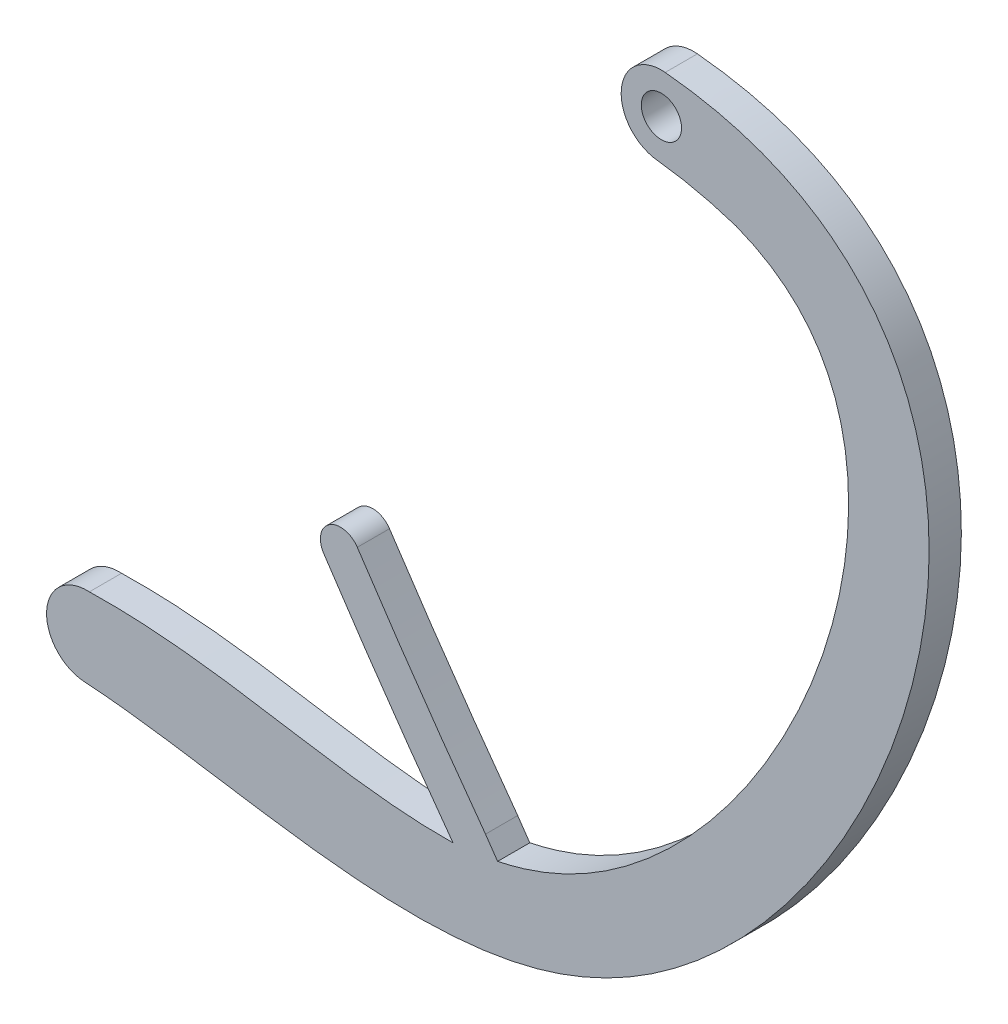
ISO-10303-21;
HEADER;
FILE_DESCRIPTION(('STEP AP214'),'2;1');
FILE_NAME('part.step','',(''),(''),'','','');
FILE_SCHEMA(('AUTOMOTIVE_DESIGN { 1 0 10303 214 1 1 1 1 }'));
ENDSEC;
DATA;
#1=APPLICATION_CONTEXT('core data for automotive mechanical design processes');
#2=APPLICATION_PROTOCOL_DEFINITION('international standard','automotive_design',2000,#1);
#3=PRODUCT_CONTEXT('',#1,'mechanical');
#4=PRODUCT('Part','Part','',(#3));
#5=PRODUCT_RELATED_PRODUCT_CATEGORY('part','',(#4));
#6=PRODUCT_DEFINITION_FORMATION('','',#4);
#7=PRODUCT_DEFINITION_CONTEXT('part definition',#1,'design');
#8=PRODUCT_DEFINITION('design','',#6,#7);
#9=PRODUCT_DEFINITION_SHAPE('','',#8);
#10=(LENGTH_UNIT() NAMED_UNIT(*) SI_UNIT(.MILLI.,.METRE.));
#11=(NAMED_UNIT(*) PLANE_ANGLE_UNIT() SI_UNIT($,.RADIAN.));
#12=(NAMED_UNIT(*) SI_UNIT($,.STERADIAN.) SOLID_ANGLE_UNIT());
#13=UNCERTAINTY_MEASURE_WITH_UNIT(LENGTH_MEASURE(1.E-05),#10,'distance_accuracy_value','');
#14=(GEOMETRIC_REPRESENTATION_CONTEXT(3) GLOBAL_UNCERTAINTY_ASSIGNED_CONTEXT((#13)) GLOBAL_UNIT_ASSIGNED_CONTEXT((#10,
#11,#12)) REPRESENTATION_CONTEXT('',''));
#15=CARTESIAN_POINT('',(0.,0.,0.));
#16=DIRECTION('',(0.,0.,1.));
#17=DIRECTION('',(1.,0.,0.));
#18=AXIS2_PLACEMENT_3D('',#15,#16,#17);
#19=CARTESIAN_POINT('',(16.1856874473945,-14.8286344581212,2.54));
#20=CARTESIAN_POINT('',(13.1592793311377,-13.8183646941323,2.54));
#21=CARTESIAN_POINT('',(9.98762753414302,-13.4478544931215,2.54));
#22=B_SPLINE_CURVE_WITH_KNOTS('',2,(#19,#20,#21),.UNSPECIFIED.,.F.,.F.,(3,3),(0.,1.),.UNSPECIFIED.);
#23=DIRECTION('',(0.,0.,-1.));
#24=VECTOR('',#23,1.);
#25=SURFACE_OF_LINEAR_EXTRUSION('',#22,#24);
#26=CARTESIAN_POINT('',(16.1856874473945,-14.8286344581212,0.));
#27=CARTESIAN_POINT('',(13.1592793311377,-13.8183646941323,0.));
#28=CARTESIAN_POINT('',(9.98762753414302,-13.4478544931215,0.));
#29=B_SPLINE_CURVE_WITH_KNOTS('',2,(#26,#27,#28),.UNSPECIFIED.,.F.,.F.,(3,3),(0.,1.),.UNSPECIFIED.);
#30=CARTESIAN_POINT('',(16.1856874473945,-14.8286344581212,0.));
#31=VERTEX_POINT('',#30);
#32=CARTESIAN_POINT('',(9.98762753414302,-13.4478544931215,0.));
#33=VERTEX_POINT('',#32);
#34=EDGE_CURVE('E152',#31,#33,#29,.T.);
#35=ORIENTED_EDGE('',*,*,#34,.F.);
#36=DIRECTION('',(0.,0.,-1.));
#37=VECTOR('',#36,1.);
#38=CARTESIAN_POINT('',(16.1856874473945,-14.8286344581212,2.54));
#39=LINE('',#38,#37);
#40=CARTESIAN_POINT('',(16.1856874473945,-14.8286344581212,2.54));
#41=VERTEX_POINT('',#40);
#42=EDGE_CURVE('E11',#41,#31,#39,.T.);
#43=ORIENTED_EDGE('',*,*,#42,.F.);
#44=CARTESIAN_POINT('',(9.98762753414302,-13.4478544931215,2.54));
#45=VERTEX_POINT('',#44);
#46=EDGE_CURVE('E255',#41,#45,#22,.T.);
#47=ORIENTED_EDGE('',*,*,#46,.T.);
#48=DIRECTION('',(0.,0.,-1.));
#49=VECTOR('',#48,1.);
#50=CARTESIAN_POINT('',(9.98762753414302,-13.4478544931215,2.54));
#51=LINE('',#50,#49);
#52=EDGE_CURVE('E37',#45,#33,#51,.T.);
#53=ORIENTED_EDGE('',*,*,#52,.T.);
#54=EDGE_LOOP('',(#35,#43,#47,#53));
#55=FACE_BOUND('',#54,.T.);
#56=ADVANCED_FACE('F33',(#55),#25,.T.);
#57=CARTESIAN_POINT('',(16.1856874473945,-14.8286344581212,2.54));
#58=CARTESIAN_POINT('',(16.6265526839877,-14.9997512197157,2.54));
#59=CARTESIAN_POINT('',(17.5162570908955,-15.3893623427278,2.54));
#60=CARTESIAN_POINT('',(19.0485915617488,-16.2336711582584,2.54));
#61=CARTESIAN_POINT('',(20.6658524057302,-17.4471017699291,2.54));
#62=CARTESIAN_POINT('',(22.1922467659509,-19.1302554128112,2.54));
#63=CARTESIAN_POINT('',(23.7873753801757,-21.7207673681195,2.54));
#64=CARTESIAN_POINT('',(25.0194069731203,-25.6971875074979,2.54));
#65=CARTESIAN_POINT('',(25.1871000738286,-31.5671889668932,2.54));
#66=CARTESIAN_POINT('',(23.9978877029221,-38.11128985955,2.54));
#67=CARTESIAN_POINT('',(20.7453501130123,-47.1328580715516,2.54));
#68=CARTESIAN_POINT('',(15.3297519904526,-55.7035893028027,2.54));
#69=CARTESIAN_POINT('',(8.62181953966754,-62.2815309515292,2.54));
#70=CARTESIAN_POINT('',(4.20573237439231,-65.2070479020961,2.54));
#71=CARTESIAN_POINT('',(0.573140932777092,-66.788454542318,2.54));
#72=CARTESIAN_POINT('',(-3.03220827111948,-67.846024472775,2.54));
#73=CARTESIAN_POINT('',(-7.96374607639919,-68.3901296204572,2.54));
#74=CARTESIAN_POINT('',(-14.3347074747987,-68.0859518898144,2.54));
#75=CARTESIAN_POINT('',(-23.2608533730056,-66.851490447541,2.54));
#76=CARTESIAN_POINT('',(-30.2160040508741,-65.6141882043738,2.54));
#77=CARTESIAN_POINT('',(-34.8398667276421,-65.3245668199312,2.54));
#78=B_SPLINE_CURVE_WITH_KNOTS('',3,(#57,#58,#59,#60,#61,#62,#63,#64,#65,#66,#67,#68,#69,#70,#71,
#72,#73,#74,#75,#76,#77),.UNSPECIFIED.,.F.,.F.,(4,1,1,1,1,1,1,1,1,1,1,1,1,1,1,1,1,1,4),
(0.0547334870670623,0.0695032763316395,0.0842730655962166,0.113812644125371,0.143352222654525,
0.17289180118368,0.231970958241988,0.291050115300297,0.350129272358605,0.409208429416914,
0.527366743533531,0.58644590059184,0.645525057650148,0.675064636179303,0.704604214708457,
0.763683371766766,0.822762528825074,0.881841685883383,1.),.UNSPECIFIED.);
#79=DIRECTION('',(0.,0.,-1.));
#80=VECTOR('',#79,1.);
#81=SURFACE_OF_LINEAR_EXTRUSION('',#78,#80);
#82=CARTESIAN_POINT('',(16.1856874473945,-14.8286344581212,0.));
#83=CARTESIAN_POINT('',(16.6265526839877,-14.9997512197157,0.));
#84=CARTESIAN_POINT('',(17.5162570908955,-15.3893623427278,0.));
#85=CARTESIAN_POINT('',(19.0485915617488,-16.2336711582584,0.));
#86=CARTESIAN_POINT('',(20.6658524057302,-17.4471017699291,0.));
#87=CARTESIAN_POINT('',(22.1922467659509,-19.1302554128112,0.));
#88=CARTESIAN_POINT('',(23.7873753801757,-21.7207673681195,0.));
#89=CARTESIAN_POINT('',(25.0194069731203,-25.6971875074979,0.));
#90=CARTESIAN_POINT('',(25.1871000738286,-31.5671889668932,0.));
#91=CARTESIAN_POINT('',(23.9978877029221,-38.11128985955,0.));
#92=CARTESIAN_POINT('',(20.7453501130123,-47.1328580715516,0.));
#93=CARTESIAN_POINT('',(15.3297519904526,-55.7035893028027,0.));
#94=CARTESIAN_POINT('',(8.62181953966754,-62.2815309515292,0.));
#95=CARTESIAN_POINT('',(4.20573237439231,-65.2070479020961,0.));
#96=CARTESIAN_POINT('',(0.573140932777092,-66.788454542318,0.));
#97=CARTESIAN_POINT('',(-3.03220827111948,-67.846024472775,0.));
#98=CARTESIAN_POINT('',(-7.96374607639919,-68.3901296204572,0.));
#99=CARTESIAN_POINT('',(-14.3347074747987,-68.0859518898144,0.));
#100=CARTESIAN_POINT('',(-23.2608533730056,-66.851490447541,0.));
#101=CARTESIAN_POINT('',(-30.2160040508741,-65.6141882043738,0.));
#102=CARTESIAN_POINT('',(-34.8398667276421,-65.3245668199312,0.));
#103=B_SPLINE_CURVE_WITH_KNOTS('',3,(#82,#83,#84,#85,#86,#87,#88,#89,#90,#91,#92,#93,#94,#95,
#96,#97,#98,#99,#100,#101,#102),.UNSPECIFIED.,.F.,.F.,(4,1,1,1,1,1,1,1,1,1,1,1,1,1,1,1,1,1,4),
(0.0547334870670623,0.0695032763316395,0.0842730655962166,0.113812644125371,0.143352222654525,
0.17289180118368,0.231970958241988,0.291050115300297,0.350129272358605,0.409208429416914,
0.527366743533531,0.58644590059184,0.645525057650148,0.675064636179303,0.704604214708457,
0.763683371766766,0.822762528825074,0.881841685883383,1.),.UNSPECIFIED.);
#104=CARTESIAN_POINT('',(-2.63315340917797,-67.6331609804477,0.));
#105=VERTEX_POINT('',#104);
#106=EDGE_CURVE('E259',#31,#105,#103,.T.);
#107=ORIENTED_EDGE('',*,*,#106,.T.);
#108=DIRECTION('',(0.,0.,-1.));
#109=VECTOR('',#108,1.);
#110=CARTESIAN_POINT('',(-2.63315340917797,-67.6331609804477,2.54));
#111=LINE('',#110,#109);
#112=CARTESIAN_POINT('',(-2.63315340917797,-67.6331609804477,2.54));
#113=VERTEX_POINT('',#112);
#114=EDGE_CURVE('E43',#113,#105,#111,.T.);
#115=ORIENTED_EDGE('',*,*,#114,.F.);
#116=EDGE_CURVE('E136',#41,#113,#78,.T.);
#117=ORIENTED_EDGE('',*,*,#116,.F.);
#118=ORIENTED_EDGE('',*,*,#42,.T.);
#119=EDGE_LOOP('',(#107,#115,#117,#118));
#120=FACE_BOUND('',#119,.T.);
#121=ADVANCED_FACE('F160',(#120),#81,.F.);
#122=CARTESIAN_POINT('',(-3.58931879589153,-66.250016050882,2.54));
#123=DIRECTION('',(0.822580681355775,0.568648417442859,0.));
#124=DIRECTION('',(-0.568648417442859,0.822580681355775,0.));
#125=AXIS2_PLACEMENT_3D('',#122,#123,#124);
#126=PLANE('',#125);
#127=CARTESIAN_POINT('',(-3.58931879589153,-66.250016050882,0.));
#128=CARTESIAN_POINT('',(-2.63315340917795,-67.6331609804478,0.));
#129=B_SPLINE_CURVE_WITH_KNOTS('',1,(#127,#128),.UNSPECIFIED.,.F.,.F.,(2,2),(0.,1.),.UNSPECIFIED.);
#130=CARTESIAN_POINT('',(-3.58931879589153,-66.250016050882,0.));
#131=VERTEX_POINT('',#130);
#132=EDGE_CURVE('E123',#131,#105,#129,.T.);
#133=ORIENTED_EDGE('',*,*,#132,.F.);
#134=DIRECTION('',(0.,0.,-1.));
#135=VECTOR('',#134,1.);
#136=CARTESIAN_POINT('',(-3.58931879589153,-66.250016050882,2.54));
#137=LINE('',#136,#135);
#138=CARTESIAN_POINT('',(-3.58931879589153,-66.250016050882,2.54));
#139=VERTEX_POINT('',#138);
#140=EDGE_CURVE('E117',#139,#131,#137,.T.);
#141=ORIENTED_EDGE('',*,*,#140,.F.);
#142=CARTESIAN_POINT('',(-3.58931879589153,-66.250016050882,2.54));
#143=CARTESIAN_POINT('',(-2.63315340917795,-67.6331609804478,2.54));
#144=B_SPLINE_CURVE_WITH_KNOTS('',1,(#142,#143),.UNSPECIFIED.,.F.,.F.,(2,2),(0.,1.),.UNSPECIFIED.);
#145=EDGE_CURVE('E121',#139,#113,#144,.T.);
#146=ORIENTED_EDGE('',*,*,#145,.T.);
#147=ORIENTED_EDGE('',*,*,#114,.T.);
#148=EDGE_LOOP('',(#133,#141,#146,#147));
#149=FACE_BOUND('',#148,.T.);
#150=ADVANCED_FACE('F119',(#149),#126,.T.);
#151=CARTESIAN_POINT('',(-3.58931879589153,-66.250016050882,2.54));
#152=CARTESIAN_POINT('',(-7.08136860731756,-61.4907522581364,2.54));
#153=CARTESIAN_POINT('',(-10.4541546178906,-56.64164042721,2.54));
#154=CARTESIAN_POINT('',(-13.7011656467252,-51.7119423519678,2.54));
#155=B_SPLINE_CURVE_WITH_KNOTS('',3,(#151,#152,#153,#154),.UNSPECIFIED.,.F.,.F.,(4,4),(0.,1.),.UNSPECIFIED.);
#156=DIRECTION('',(0.,0.,-1.));
#157=VECTOR('',#156,1.);
#158=SURFACE_OF_LINEAR_EXTRUSION('',#155,#157);
#159=CARTESIAN_POINT('',(-3.58931879589153,-66.250016050882,0.));
#160=CARTESIAN_POINT('',(-7.08136860731756,-61.4907522581364,0.));
#161=CARTESIAN_POINT('',(-10.4541546178906,-56.64164042721,0.));
#162=CARTESIAN_POINT('',(-13.7011656467252,-51.7119423519678,0.));
#163=B_SPLINE_CURVE_WITH_KNOTS('',3,(#159,#160,#161,#162),.UNSPECIFIED.,.F.,.F.,(4,4),(0.,1.),.UNSPECIFIED.);
#164=CARTESIAN_POINT('',(-13.7011656467252,-51.7119423519678,0.));
#165=VERTEX_POINT('',#164);
#166=EDGE_CURVE('E264',#131,#165,#163,.T.);
#167=ORIENTED_EDGE('',*,*,#166,.T.);
#168=DIRECTION('',(0.,0.,-1.));
#169=VECTOR('',#168,1.);
#170=CARTESIAN_POINT('',(-13.7011656467252,-51.7119423519678,2.54));
#171=LINE('',#170,#169);
#172=CARTESIAN_POINT('',(-13.7011656467252,-51.7119423519678,2.54));
#173=VERTEX_POINT('',#172);
#174=EDGE_CURVE('E126',#173,#165,#171,.T.);
#175=ORIENTED_EDGE('',*,*,#174,.F.);
#176=EDGE_CURVE('E129',#139,#173,#155,.T.);
#177=ORIENTED_EDGE('',*,*,#176,.F.);
#178=ORIENTED_EDGE('',*,*,#140,.T.);
#179=EDGE_LOOP('',(#167,#175,#177,#178));
#180=FACE_BOUND('',#179,.T.);
#181=ADVANCED_FACE('F130',(#180),#158,.F.);
#182=CARTESIAN_POINT('',(-15.0269222457325,-52.5851695218316,2.54));
#183=DIRECTION('',(0.,0.,-1.));
#184=DIRECTION('',(-1.,0.,0.));
#185=AXIS2_PLACEMENT_3D('',#182,#183,#184);
#186=CYLINDRICAL_SURFACE('',#185,1.5875);
#187=CARTESIAN_POINT('',(-15.0269222457325,-52.5851695218316,0.));
#188=DIRECTION('',(0.,0.,1.));
#189=DIRECTION('',(1.,0.,0.));
#190=AXIS2_PLACEMENT_3D('',#187,#188,#189);
#191=CIRCLE('',#190,1.5875);
#192=CARTESIAN_POINT('',(-16.3526788447399,-53.4583966916955,0.));
#193=VERTEX_POINT('',#192);
#194=EDGE_CURVE('E200',#165,#193,#191,.T.);
#195=ORIENTED_EDGE('',*,*,#194,.T.);
#196=DIRECTION('',(0.,0.,-1.));
#197=VECTOR('',#196,1.);
#198=CARTESIAN_POINT('',(-16.3526788447399,-53.4583966916955,2.54));
#199=LINE('',#198,#197);
#200=CARTESIAN_POINT('',(-16.3526788447399,-53.4583966916955,2.54));
#201=VERTEX_POINT('',#200);
#202=EDGE_CURVE('E198',#201,#193,#199,.T.);
#203=ORIENTED_EDGE('',*,*,#202,.F.);
#204=CARTESIAN_POINT('',(-15.0269222457325,-52.5851695218316,2.54));
#205=DIRECTION('',(0.,0.,1.));
#206=DIRECTION('',(1.,0.,0.));
#207=AXIS2_PLACEMENT_3D('',#204,#205,#206);
#208=CIRCLE('',#207,1.5875);
#209=EDGE_CURVE('E133',#173,#201,#208,.T.);
#210=ORIENTED_EDGE('',*,*,#209,.F.);
#211=ORIENTED_EDGE('',*,*,#174,.T.);
#212=EDGE_LOOP('',(#195,#203,#210,#211));
#213=FACE_BOUND('',#212,.T.);
#214=ADVANCED_FACE('F170',(#213),#186,.T.);
#215=CARTESIAN_POINT('',(-6.1491613190421,-68.1282682322118,2.54));
#216=CARTESIAN_POINT('',(-9.67421734563241,-63.3240207498714,2.54));
#217=CARTESIAN_POINT('',(-13.0753898541983,-58.4340635696993,2.54));
#218=CARTESIAN_POINT('',(-16.3526788447399,-53.4583966916955,2.54));
#219=B_SPLINE_CURVE_WITH_KNOTS('',3,(#215,#216,#217,#218),.UNSPECIFIED.,.F.,.F.,(4,4),(0.,1.),.UNSPECIFIED.);
#220=DIRECTION('',(0.,0.,-1.));
#221=VECTOR('',#220,1.);
#222=SURFACE_OF_LINEAR_EXTRUSION('',#219,#221);
#223=CARTESIAN_POINT('',(-6.1491613190421,-68.1282682322118,0.));
#224=CARTESIAN_POINT('',(-9.67421734563241,-63.3240207498714,0.));
#225=CARTESIAN_POINT('',(-13.0753898541983,-58.4340635696993,0.));
#226=CARTESIAN_POINT('',(-16.3526788447399,-53.4583966916955,0.));
#227=B_SPLINE_CURVE_WITH_KNOTS('',3,(#223,#224,#225,#226),.UNSPECIFIED.,.F.,.F.,(4,4),(0.,1.),.UNSPECIFIED.);
#228=CARTESIAN_POINT('',(-6.1491613190421,-68.1282682322118,0.));
#229=VERTEX_POINT('',#228);
#230=EDGE_CURVE('E206',#229,#193,#227,.T.);
#231=ORIENTED_EDGE('',*,*,#230,.F.);
#232=DIRECTION('',(0.,0.,-1.));
#233=VECTOR('',#232,1.);
#234=CARTESIAN_POINT('',(-6.1491613190421,-68.1282682322118,2.54));
#235=LINE('',#234,#233);
#236=CARTESIAN_POINT('',(-6.1491613190421,-68.1282682322118,2.54));
#237=VERTEX_POINT('',#236);
#238=EDGE_CURVE('E203',#237,#229,#235,.T.);
#239=ORIENTED_EDGE('',*,*,#238,.F.);
#240=EDGE_CURVE('E182',#237,#201,#219,.T.);
#241=ORIENTED_EDGE('',*,*,#240,.T.);
#242=ORIENTED_EDGE('',*,*,#202,.T.);
#243=EDGE_LOOP('',(#231,#239,#241,#242));
#244=FACE_BOUND('',#243,.T.);
#245=ADVANCED_FACE('F173',(#244),#222,.T.);
#246=CARTESIAN_POINT('',(-6.1491613190421,-68.1282682322118,2.54));
#247=CARTESIAN_POINT('',(-11.7544050249348,-68.2161560131135,2.54));
#248=CARTESIAN_POINT('',(-21.1788863134655,-66.2414918770751,2.54));
#249=CARTESIAN_POINT('',(-30.778963239153,-65.21520527888,2.54));
#250=CARTESIAN_POINT('',(-34.8398632596566,-65.3245528516356,2.54));
#251=B_SPLINE_CURVE_WITH_KNOTS('',3,(#246,#247,#248,#249,#250),.UNSPECIFIED.,.F.,.F.,(4,1,4),
(0.,0.578093231759391,1.),.UNSPECIFIED.);
#252=DIRECTION('',(0.,0.,-1.));
#253=VECTOR('',#252,1.);
#254=SURFACE_OF_LINEAR_EXTRUSION('',#251,#253);
#255=CARTESIAN_POINT('',(-6.1491613190421,-68.1282682322118,0.));
#256=CARTESIAN_POINT('',(-11.7544050249348,-68.2161560131135,0.));
#257=CARTESIAN_POINT('',(-21.1788863134655,-66.2414918770751,0.));
#258=CARTESIAN_POINT('',(-30.778963239153,-65.21520527888,0.));
#259=CARTESIAN_POINT('',(-34.8398632596566,-65.3245528516356,0.));
#260=B_SPLINE_CURVE_WITH_KNOTS('',3,(#255,#256,#257,#258,#259),.UNSPECIFIED.,.F.,.F.,(4,1,4),
(0.,0.578093231759391,1.),.UNSPECIFIED.);
#261=CARTESIAN_POINT('',(-34.8398632596566,-65.3245528516356,0.));
#262=VERTEX_POINT('',#261);
#263=EDGE_CURVE('E286',#229,#262,#260,.T.);
#264=ORIENTED_EDGE('',*,*,#263,.T.);
#265=DIRECTION('',(0.,0.,-1.));
#266=VECTOR('',#265,1.);
#267=CARTESIAN_POINT('',(-34.8398632596566,-65.3245528516356,2.54));
#268=LINE('',#267,#266);
#269=CARTESIAN_POINT('',(-34.8398632596566,-65.3245528516356,2.54));
#270=VERTEX_POINT('',#269);
#271=EDGE_CURVE('E209',#270,#262,#268,.T.);
#272=ORIENTED_EDGE('',*,*,#271,.F.);
#273=EDGE_CURVE('E187',#237,#270,#251,.T.);
#274=ORIENTED_EDGE('',*,*,#273,.F.);
#275=ORIENTED_EDGE('',*,*,#238,.T.);
#276=EDGE_LOOP('',(#264,#272,#274,#275));
#277=FACE_BOUND('',#276,.T.);
#278=ADVANCED_FACE('F178',(#277),#254,.F.);
#279=CARTESIAN_POINT('',(-35.0383446913326,-68.4933428606579,2.54));
#280=DIRECTION('',(0.,0.,-1.));
#281=DIRECTION('',(-1.,0.,0.));
#282=AXIS2_PLACEMENT_3D('',#279,#280,#281);
#283=CYLINDRICAL_SURFACE('',#282,3.175);
#284=CARTESIAN_POINT('',(-35.0383446913326,-68.4933428606579,0.));
#285=DIRECTION('',(0.,0.,1.));
#286=DIRECTION('',(1.,0.,0.));
#287=AXIS2_PLACEMENT_3D('',#284,#285,#286);
#288=CIRCLE('',#287,3.175);
#289=CARTESIAN_POINT('',(-35.2368261230086,-71.6621328696803,0.));
#290=VERTEX_POINT('',#289);
#291=EDGE_CURVE('E284',#262,#290,#288,.T.);
#292=ORIENTED_EDGE('',*,*,#291,.T.);
#293=DIRECTION('',(0.,0.,-1.));
#294=VECTOR('',#293,1.);
#295=CARTESIAN_POINT('',(-35.2368261230086,-71.6621328696803,2.54));
#296=LINE('',#295,#294);
#297=CARTESIAN_POINT('',(-35.2368261230086,-71.6621328696803,2.54));
#298=VERTEX_POINT('',#297);
#299=EDGE_CURVE('E278',#298,#290,#296,.T.);
#300=ORIENTED_EDGE('',*,*,#299,.F.);
#301=CARTESIAN_POINT('',(-35.0383446913326,-68.4933428606579,2.54));
#302=DIRECTION('',(0.,0.,1.));
#303=DIRECTION('',(1.,0.,0.));
#304=AXIS2_PLACEMENT_3D('',#301,#302,#303);
#305=CIRCLE('',#304,3.175);
#306=EDGE_CURVE('E214',#270,#298,#305,.T.);
#307=ORIENTED_EDGE('',*,*,#306,.F.);
#308=ORIENTED_EDGE('',*,*,#271,.T.);
#309=EDGE_LOOP('',(#292,#300,#307,#308));
#310=FACE_BOUND('',#309,.T.);
#311=ADVANCED_FACE('F230',(#310),#283,.T.);
#312=CARTESIAN_POINT('',(10.586372465857,-7.12614550687844,2.54));
#313=CARTESIAN_POINT('',(11.0025256817417,-7.16556042290348,2.54));
#314=CARTESIAN_POINT('',(11.8420095813493,-7.25959403096603,2.54));
#315=CARTESIAN_POINT('',(13.445793666436,-7.49782194122731,2.54));
#316=CARTESIAN_POINT('',(15.3585084276082,-7.89279020111373,2.54));
#317=CARTESIAN_POINT('',(17.4937154344995,-8.51632734794415,2.54));
#318=CARTESIAN_POINT('',(20.134435016772,-9.54131958514287,2.54));
#319=CARTESIAN_POINT('',(23.0478949522207,-11.1729370862544,2.54));
#320=CARTESIAN_POINT('',(25.9214754737985,-13.6389729032956,2.54));
#321=CARTESIAN_POINT('',(28.1703177338175,-16.5399175807537,2.54));
#322=CARTESIAN_POINT('',(30.3566394985441,-20.8772845417327,2.54));
#323=CARTESIAN_POINT('',(31.6511811302994,-26.9781578874707,2.54));
#324=CARTESIAN_POINT('',(31.2409370451017,-34.908794595258,2.54));
#325=CARTESIAN_POINT('',(29.1560039413862,-43.069094128688,2.54));
#326=CARTESIAN_POINT('',(25.6359954143011,-51.076251650364,2.54));
#327=CARTESIAN_POINT('',(20.9006703895226,-58.5388405736958,2.54));
#328=CARTESIAN_POINT('',(15.1509764092877,-65.0507056998108,2.54));
#329=CARTESIAN_POINT('',(8.58799711651118,-70.2142199027032,2.54));
#330=CARTESIAN_POINT('',(1.33516782318682,-73.5324972911283,2.54));
#331=CARTESIAN_POINT('',(-6.19734322745507,-74.7301841377215,2.54));
#332=CARTESIAN_POINT('',(-13.7669679544778,-74.543564506064,2.54));
#333=CARTESIAN_POINT('',(-19.9970781397919,-73.723544540593,2.54));
#334=CARTESIAN_POINT('',(-24.8635337575538,-72.9622559776625,2.54));
#335=CARTESIAN_POINT('',(-28.4363629606819,-72.4080856734912,2.54));
#336=CARTESIAN_POINT('',(-31.3285570339177,-72.0183155926922,2.54));
#337=CARTESIAN_POINT('',(-33.5880221693556,-71.7827998106312,2.54));
#338=CARTESIAN_POINT('',(-34.6838200178199,-71.6967711521701,2.54));
#339=CARTESIAN_POINT('',(-35.2368261230086,-71.6621328696803,2.54));
#340=B_SPLINE_CURVE_WITH_KNOTS('',3,(#312,#313,#314,#315,#316,#317,#318,#319,#320,#321,#322,
#323,#324,#325,#326,#327,#328,#329,#330,#331,#332,#333,#334,#335,#336,#337,#338,#339),
.UNSPECIFIED.,.F.,.F.,(4,1,1,1,1,1,1,1,1,1,1,1,1,1,1,1,1,1,1,1,1,1,1,1,1,4),(0.,0.0078125,
0.015625,0.03125,0.046875,0.0625,0.09375,0.125,0.15625,0.1875,0.25,0.3125,0.375,0.4375,0.5,
0.5625,0.625,0.6875,0.75,0.8125,0.875,0.90625,0.9375,0.96875,0.984375,1.),.UNSPECIFIED.);
#341=DIRECTION('',(0.,0.,-1.));
#342=VECTOR('',#341,1.);
#343=SURFACE_OF_LINEAR_EXTRUSION('',#340,#342);
#344=CARTESIAN_POINT('',(10.586372465857,-7.12614550687844,0.));
#345=CARTESIAN_POINT('',(11.0025256817417,-7.16556042290348,0.));
#346=CARTESIAN_POINT('',(11.8420095813493,-7.25959403096603,0.));
#347=CARTESIAN_POINT('',(13.445793666436,-7.49782194122731,0.));
#348=CARTESIAN_POINT('',(15.3585084276082,-7.89279020111373,0.));
#349=CARTESIAN_POINT('',(17.4937154344995,-8.51632734794415,0.));
#350=CARTESIAN_POINT('',(20.134435016772,-9.54131958514287,0.));
#351=CARTESIAN_POINT('',(23.0478949522207,-11.1729370862544,0.));
#352=CARTESIAN_POINT('',(25.9214754737985,-13.6389729032956,0.));
#353=CARTESIAN_POINT('',(28.1703177338175,-16.5399175807537,0.));
#354=CARTESIAN_POINT('',(30.3566394985441,-20.8772845417327,0.));
#355=CARTESIAN_POINT('',(31.6511811302994,-26.9781578874707,0.));
#356=CARTESIAN_POINT('',(31.2409370451017,-34.908794595258,0.));
#357=CARTESIAN_POINT('',(29.1560039413862,-43.069094128688,0.));
#358=CARTESIAN_POINT('',(25.6359954143011,-51.076251650364,0.));
#359=CARTESIAN_POINT('',(20.9006703895226,-58.5388405736958,0.));
#360=CARTESIAN_POINT('',(15.1509764092877,-65.0507056998108,0.));
#361=CARTESIAN_POINT('',(8.58799711651118,-70.2142199027032,0.));
#362=CARTESIAN_POINT('',(1.33516782318682,-73.5324972911283,0.));
#363=CARTESIAN_POINT('',(-6.19734322745507,-74.7301841377215,0.));
#364=CARTESIAN_POINT('',(-13.7669679544778,-74.543564506064,0.));
#365=CARTESIAN_POINT('',(-19.9970781397919,-73.723544540593,0.));
#366=CARTESIAN_POINT('',(-24.8635337575538,-72.9622559776625,0.));
#367=CARTESIAN_POINT('',(-28.4363629606819,-72.4080856734912,0.));
#368=CARTESIAN_POINT('',(-31.3285570339177,-72.0183155926922,0.));
#369=CARTESIAN_POINT('',(-33.5880221693556,-71.7827998106312,0.));
#370=CARTESIAN_POINT('',(-34.6838200178199,-71.6967711521701,0.));
#371=CARTESIAN_POINT('',(-35.2368261230086,-71.6621328696803,0.));
#372=B_SPLINE_CURVE_WITH_KNOTS('',3,(#344,#345,#346,#347,#348,#349,#350,#351,#352,#353,#354,
#355,#356,#357,#358,#359,#360,#361,#362,#363,#364,#365,#366,#367,#368,#369,#370,#371),
.UNSPECIFIED.,.F.,.F.,(4,1,1,1,1,1,1,1,1,1,1,1,1,1,1,1,1,1,1,1,1,1,1,1,1,4),(0.,0.0078125,
0.015625,0.03125,0.046875,0.0625,0.09375,0.125,0.15625,0.1875,0.25,0.3125,0.375,0.4375,0.5,
0.5625,0.625,0.6875,0.75,0.8125,0.875,0.90625,0.9375,0.96875,0.984375,1.),.UNSPECIFIED.);
#373=CARTESIAN_POINT('',(10.586372465857,-7.12614550687844,0.));
#374=VERTEX_POINT('',#373);
#375=EDGE_CURVE('E247',#374,#290,#372,.T.);
#376=ORIENTED_EDGE('',*,*,#375,.F.);
#377=DIRECTION('',(0.,0.,-1.));
#378=VECTOR('',#377,1.);
#379=CARTESIAN_POINT('',(10.586372465857,-7.12614550687844,2.54));
#380=LINE('',#379,#378);
#381=CARTESIAN_POINT('',(10.586372465857,-7.12614550687844,2.54));
#382=VERTEX_POINT('',#381);
#383=EDGE_CURVE('E279',#382,#374,#380,.T.);
#384=ORIENTED_EDGE('',*,*,#383,.F.);
#385=EDGE_CURVE('E215',#382,#298,#340,.T.);
#386=ORIENTED_EDGE('',*,*,#385,.T.);
#387=ORIENTED_EDGE('',*,*,#299,.T.);
#388=EDGE_LOOP('',(#376,#384,#386,#387));
#389=FACE_BOUND('',#388,.T.);
#390=ADVANCED_FACE('F227',(#389),#343,.T.);
#391=CARTESIAN_POINT('',(10.287,-10.287,2.54));
#392=DIRECTION('',(0.,0.,-1.));
#393=DIRECTION('',(-1.,0.,0.));
#394=AXIS2_PLACEMENT_3D('',#391,#392,#393);
#395=CYLINDRICAL_SURFACE('',#394,3.175);
#396=CARTESIAN_POINT('',(10.287,-10.287,0.));
#397=DIRECTION('',(0.,0.,1.));
#398=DIRECTION('',(1.,0.,0.));
#399=AXIS2_PLACEMENT_3D('',#396,#397,#398);
#400=CIRCLE('',#399,3.175);
#401=EDGE_CURVE('E245',#374,#33,#400,.T.);
#402=ORIENTED_EDGE('',*,*,#401,.T.);
#403=ORIENTED_EDGE('',*,*,#52,.F.);
#404=CARTESIAN_POINT('',(10.287,-10.287,2.54));
#405=DIRECTION('',(0.,0.,1.));
#406=DIRECTION('',(1.,0.,0.));
#407=AXIS2_PLACEMENT_3D('',#404,#405,#406);
#408=CIRCLE('',#407,3.175);
#409=EDGE_CURVE('E97',#382,#45,#408,.T.);
#410=ORIENTED_EDGE('',*,*,#409,.F.);
#411=ORIENTED_EDGE('',*,*,#383,.T.);
#412=EDGE_LOOP('',(#402,#403,#410,#411));
#413=FACE_BOUND('',#412,.T.);
#414=ADVANCED_FACE('F229',(#413),#395,.T.);
#415=CARTESIAN_POINT('',(13.1229684109533,-13.9783045848768,2.54));
#416=DIRECTION('',(0.,0.,-1.));
#417=DIRECTION('',(-1.,0.,0.));
#418=AXIS2_PLACEMENT_3D('',#415,#416,#417);
#419=PLANE('',#418);
#420=CARTESIAN_POINT('',(10.287,-10.287,2.54));
#421=DIRECTION('',(0.,0.,-1.));
#422=DIRECTION('',(-1.,0.,0.));
#423=AXIS2_PLACEMENT_3D('',#420,#421,#422);
#424=CIRCLE('',#423,1.5875);
#425=CARTESIAN_POINT('',(8.6995,-10.287,2.54));
#426=VERTEX_POINT('',#425);
#427=EDGE_CURVE('E246',#426,#426,#424,.F.);
#428=ORIENTED_EDGE('',*,*,#427,.F.);
#429=EDGE_LOOP('',(#428));
#430=FACE_BOUND('',#429,.T.);
#431=ORIENTED_EDGE('',*,*,#46,.F.);
#432=ORIENTED_EDGE('',*,*,#116,.T.);
#433=ORIENTED_EDGE('',*,*,#145,.F.);
#434=ORIENTED_EDGE('',*,*,#176,.T.);
#435=ORIENTED_EDGE('',*,*,#209,.T.);
#436=ORIENTED_EDGE('',*,*,#240,.F.);
#437=ORIENTED_EDGE('',*,*,#273,.T.);
#438=ORIENTED_EDGE('',*,*,#306,.T.);
#439=ORIENTED_EDGE('',*,*,#385,.F.);
#440=ORIENTED_EDGE('',*,*,#409,.T.);
#441=EDGE_LOOP('',(#431,#432,#433,#434,#435,#436,#437,#438,#439,#440));
#442=FACE_BOUND('',#441,.T.);
#443=ADVANCED_FACE('F135',(#430,#442),#419,.F.);
#444=CARTESIAN_POINT('',(13.1229684109533,-13.9783045848768,0.));
#445=DIRECTION('',(0.,0.,-1.));
#446=DIRECTION('',(-1.,0.,0.));
#447=AXIS2_PLACEMENT_3D('',#444,#445,#446);
#448=PLANE('',#447);
#449=CARTESIAN_POINT('',(10.287,-10.287,0.));
#450=DIRECTION('',(0.,0.,-1.));
#451=DIRECTION('',(-1.,0.,0.));
#452=AXIS2_PLACEMENT_3D('',#449,#450,#451);
#453=CIRCLE('',#452,1.5875);
#454=CARTESIAN_POINT('',(8.6995,-10.287,0.));
#455=VERTEX_POINT('',#454);
#456=EDGE_CURVE('E249',#455,#455,#453,.T.);
#457=ORIENTED_EDGE('',*,*,#456,.F.);
#458=EDGE_LOOP('',(#457));
#459=FACE_BOUND('',#458,.T.);
#460=ORIENTED_EDGE('',*,*,#34,.T.);
#461=ORIENTED_EDGE('',*,*,#401,.F.);
#462=ORIENTED_EDGE('',*,*,#375,.T.);
#463=ORIENTED_EDGE('',*,*,#291,.F.);
#464=ORIENTED_EDGE('',*,*,#263,.F.);
#465=ORIENTED_EDGE('',*,*,#230,.T.);
#466=ORIENTED_EDGE('',*,*,#194,.F.);
#467=ORIENTED_EDGE('',*,*,#166,.F.);
#468=ORIENTED_EDGE('',*,*,#132,.T.);
#469=ORIENTED_EDGE('',*,*,#106,.F.);
#470=EDGE_LOOP('',(#460,#461,#462,#463,#464,#465,#466,#467,#468,#469));
#471=FACE_BOUND('',#470,.T.);
#472=ADVANCED_FACE('F164',(#459,#471),#448,.T.);
#473=CARTESIAN_POINT('',(10.287,-10.287,2.541));
#474=DIRECTION('',(0.,0.,-1.));
#475=DIRECTION('',(-1.,0.,0.));
#476=AXIS2_PLACEMENT_3D('',#473,#474,#475);
#477=CYLINDRICAL_SURFACE('',#476,1.5875);
#478=ORIENTED_EDGE('',*,*,#456,.T.);
#479=EDGE_LOOP('',(#478));
#480=FACE_BOUND('',#479,.T.);
#481=ORIENTED_EDGE('',*,*,#427,.T.);
#482=EDGE_LOOP('',(#481));
#483=FACE_BOUND('',#482,.T.);
#484=ADVANCED_FACE('F380',(#480,#483),#477,.F.);
#485=CLOSED_SHELL('',(#56,#121,#150,#181,#214,#245,#278,#311,#390,#414,#443,#472,#484));
#486=MANIFOLD_SOLID_BREP('B2',#485);
#487=ADVANCED_BREP_SHAPE_REPRESENTATION('',(#18,#486),#14);
#488=SHAPE_DEFINITION_REPRESENTATION(#9,#487);
ENDSEC;
END-ISO-10303-21;
